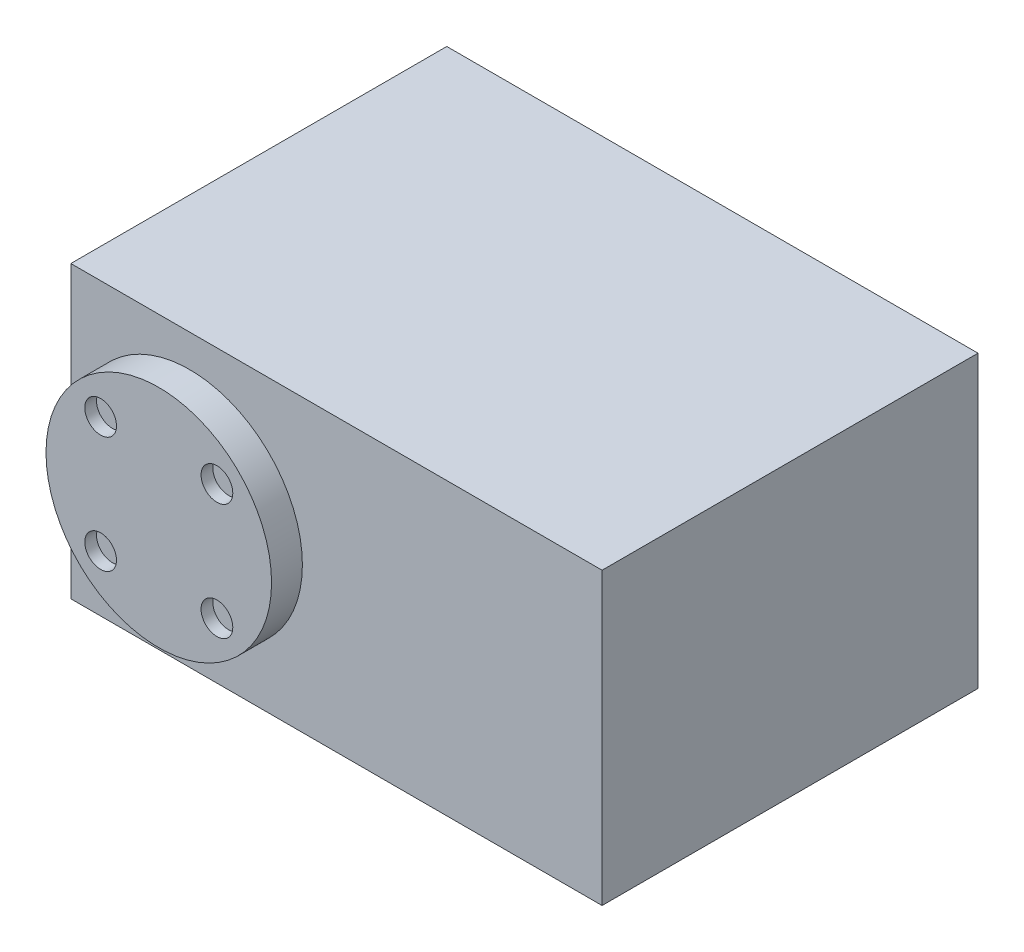
ISO-10303-21;
HEADER;
FILE_DESCRIPTION(('STEP AP214'),'2;1');
FILE_NAME('part.step','',(''),(''),'','','');
FILE_SCHEMA(('AUTOMOTIVE_DESIGN { 1 0 10303 214 1 1 1 1 }'));
ENDSEC;
DATA;
#1=APPLICATION_CONTEXT('core data for automotive mechanical design processes');
#2=APPLICATION_PROTOCOL_DEFINITION('international standard','automotive_design',2000,#1);
#3=PRODUCT_CONTEXT('',#1,'mechanical');
#4=PRODUCT('Part','Part','',(#3));
#5=PRODUCT_RELATED_PRODUCT_CATEGORY('part','',(#4));
#6=PRODUCT_DEFINITION_FORMATION('','',#4);
#7=PRODUCT_DEFINITION_CONTEXT('part definition',#1,'design');
#8=PRODUCT_DEFINITION('design','',#6,#7);
#9=PRODUCT_DEFINITION_SHAPE('','',#8);
#10=(LENGTH_UNIT() NAMED_UNIT(*) SI_UNIT(.MILLI.,.METRE.));
#11=(NAMED_UNIT(*) PLANE_ANGLE_UNIT() SI_UNIT($,.RADIAN.));
#12=(NAMED_UNIT(*) SI_UNIT($,.STERADIAN.) SOLID_ANGLE_UNIT());
#13=UNCERTAINTY_MEASURE_WITH_UNIT(LENGTH_MEASURE(1.E-05),#10,'distance_accuracy_value','');
#14=(GEOMETRIC_REPRESENTATION_CONTEXT(3) GLOBAL_UNCERTAINTY_ASSIGNED_CONTEXT((#13)) GLOBAL_UNIT_ASSIGNED_CONTEXT((#10,
#11,#12)) REPRESENTATION_CONTEXT('',''));
#15=CARTESIAN_POINT('',(0.,0.,0.));
#16=DIRECTION('',(0.,0.,1.));
#17=DIRECTION('',(1.,0.,0.));
#18=AXIS2_PLACEMENT_3D('',#15,#16,#17);
#19=CARTESIAN_POINT('',(-10.11,12.36,16.));
#20=DIRECTION('',(1.,0.,0.));
#21=DIRECTION('',(0.,0.,-1.));
#22=AXIS2_PLACEMENT_3D('',#19,#20,#21);
#23=PLANE('',#22);
#24=DIRECTION('',(0.,-1.,0.));
#25=VECTOR('',#24,1.);
#26=CARTESIAN_POINT('',(-10.11,12.36,-16.));
#27=LINE('',#26,#25);
#28=CARTESIAN_POINT('',(-10.11,12.36,-16.));
#29=VERTEX_POINT('',#28);
#30=CARTESIAN_POINT('',(-10.11,-12.36,-16.));
#31=VERTEX_POINT('',#30);
#32=EDGE_CURVE('E110',#29,#31,#27,.T.);
#33=ORIENTED_EDGE('',*,*,#32,.T.);
#34=DIRECTION('',(0.,0.,-1.));
#35=VECTOR('',#34,1.);
#36=CARTESIAN_POINT('',(-10.11,-12.36,16.));
#37=LINE('',#36,#35);
#38=CARTESIAN_POINT('',(-10.11,-12.36,16.));
#39=VERTEX_POINT('',#38);
#40=EDGE_CURVE('E48',#39,#31,#37,.T.);
#41=ORIENTED_EDGE('',*,*,#40,.F.);
#42=DIRECTION('',(0.,-1.,0.));
#43=VECTOR('',#42,1.);
#44=CARTESIAN_POINT('',(-10.11,12.36,16.));
#45=LINE('',#44,#43);
#46=CARTESIAN_POINT('',(-10.11,12.36,16.));
#47=VERTEX_POINT('',#46);
#48=EDGE_CURVE('E91',#47,#39,#45,.T.);
#49=ORIENTED_EDGE('',*,*,#48,.F.);
#50=DIRECTION('',(0.,0.,-1.));
#51=VECTOR('',#50,1.);
#52=CARTESIAN_POINT('',(-10.11,12.36,16.));
#53=LINE('',#52,#51);
#54=EDGE_CURVE('E103',#47,#29,#53,.T.);
#55=ORIENTED_EDGE('',*,*,#54,.T.);
#56=EDGE_LOOP('',(#33,#41,#49,#55));
#57=FACE_BOUND('',#56,.T.);
#58=ADVANCED_FACE('F39',(#57),#23,.F.);
#59=CARTESIAN_POINT('',(-10.11,-12.36,16.));
#60=DIRECTION('',(0.,1.,0.));
#61=DIRECTION('',(0.,0.,1.));
#62=AXIS2_PLACEMENT_3D('',#59,#60,#61);
#63=PLANE('',#62);
#64=DIRECTION('',(1.,0.,0.));
#65=VECTOR('',#64,1.);
#66=CARTESIAN_POINT('',(-10.11,-12.36,-16.));
#67=LINE('',#66,#65);
#68=CARTESIAN_POINT('',(35.11,-12.36,-16.));
#69=VERTEX_POINT('',#68);
#70=EDGE_CURVE('E98',#31,#69,#67,.T.);
#71=ORIENTED_EDGE('',*,*,#70,.T.);
#72=DIRECTION('',(0.,0.,-1.));
#73=VECTOR('',#72,1.);
#74=CARTESIAN_POINT('',(35.11,-12.36,16.));
#75=LINE('',#74,#73);
#76=CARTESIAN_POINT('',(35.11,-12.36,16.));
#77=VERTEX_POINT('',#76);
#78=EDGE_CURVE('E96',#77,#69,#75,.T.);
#79=ORIENTED_EDGE('',*,*,#78,.F.);
#80=DIRECTION('',(1.,0.,0.));
#81=VECTOR('',#80,1.);
#82=CARTESIAN_POINT('',(-10.11,-12.36,16.));
#83=LINE('',#82,#81);
#84=EDGE_CURVE('E86',#39,#77,#83,.T.);
#85=ORIENTED_EDGE('',*,*,#84,.F.);
#86=ORIENTED_EDGE('',*,*,#40,.T.);
#87=EDGE_LOOP('',(#71,#79,#85,#86));
#88=FACE_BOUND('',#87,.T.);
#89=ADVANCED_FACE('F100',(#88),#63,.F.);
#90=CARTESIAN_POINT('',(35.11,-12.36,16.));
#91=DIRECTION('',(-1.,0.,0.));
#92=DIRECTION('',(0.,0.,1.));
#93=AXIS2_PLACEMENT_3D('',#90,#91,#92);
#94=PLANE('',#93);
#95=DIRECTION('',(0.,1.,0.));
#96=VECTOR('',#95,1.);
#97=CARTESIAN_POINT('',(35.11,-12.36,-16.));
#98=LINE('',#97,#96);
#99=CARTESIAN_POINT('',(35.11,12.36,-16.));
#100=VERTEX_POINT('',#99);
#101=EDGE_CURVE('E74',#69,#100,#98,.T.);
#102=ORIENTED_EDGE('',*,*,#101,.T.);
#103=DIRECTION('',(0.,0.,-1.));
#104=VECTOR('',#103,1.);
#105=CARTESIAN_POINT('',(35.11,12.36,16.));
#106=LINE('',#105,#104);
#107=CARTESIAN_POINT('',(35.11,12.36,16.));
#108=VERTEX_POINT('',#107);
#109=EDGE_CURVE('E97',#108,#100,#106,.T.);
#110=ORIENTED_EDGE('',*,*,#109,.F.);
#111=DIRECTION('',(0.,1.,0.));
#112=VECTOR('',#111,1.);
#113=CARTESIAN_POINT('',(35.11,-12.36,16.));
#114=LINE('',#113,#112);
#115=EDGE_CURVE('E93',#77,#108,#114,.T.);
#116=ORIENTED_EDGE('',*,*,#115,.F.);
#117=ORIENTED_EDGE('',*,*,#78,.T.);
#118=EDGE_LOOP('',(#102,#110,#116,#117));
#119=FACE_BOUND('',#118,.T.);
#120=ADVANCED_FACE('F101',(#119),#94,.F.);
#121=CARTESIAN_POINT('',(35.11,12.36,16.));
#122=DIRECTION('',(0.,-1.,0.));
#123=DIRECTION('',(0.,0.,-1.));
#124=AXIS2_PLACEMENT_3D('',#121,#122,#123);
#125=PLANE('',#124);
#126=DIRECTION('',(-1.,0.,0.));
#127=VECTOR('',#126,1.);
#128=CARTESIAN_POINT('',(35.11,12.36,-16.));
#129=LINE('',#128,#127);
#130=EDGE_CURVE('E77',#100,#29,#129,.T.);
#131=ORIENTED_EDGE('',*,*,#130,.T.);
#132=ORIENTED_EDGE('',*,*,#54,.F.);
#133=DIRECTION('',(-1.,0.,0.));
#134=VECTOR('',#133,1.);
#135=CARTESIAN_POINT('',(35.11,12.36,16.));
#136=LINE('',#135,#134);
#137=EDGE_CURVE('E60',#108,#47,#136,.T.);
#138=ORIENTED_EDGE('',*,*,#137,.F.);
#139=ORIENTED_EDGE('',*,*,#109,.T.);
#140=EDGE_LOOP('',(#131,#132,#138,#139));
#141=FACE_BOUND('',#140,.T.);
#142=ADVANCED_FACE('F176',(#141),#125,.F.);
#143=CARTESIAN_POINT('',(0.,0.,16.));
#144=DIRECTION('',(0.,0.,1.));
#145=DIRECTION('',(1.,0.,0.));
#146=AXIS2_PLACEMENT_3D('',#143,#144,#145);
#147=PLANE('',#146);
#148=CARTESIAN_POINT('',(0.,0.,16.));
#149=DIRECTION('',(0.,0.,1.));
#150=DIRECTION('',(1.,0.,0.));
#151=AXIS2_PLACEMENT_3D('',#148,#149,#150);
#152=CIRCLE('',#151,9.6);
#153=CARTESIAN_POINT('',(9.6,0.,16.));
#154=VERTEX_POINT('',#153);
#155=EDGE_CURVE('E109',#154,#154,#152,.F.);
#156=ORIENTED_EDGE('',*,*,#155,.T.);
#157=EDGE_LOOP('',(#156));
#158=FACE_BOUND('',#157,.T.);
#159=ORIENTED_EDGE('',*,*,#48,.T.);
#160=ORIENTED_EDGE('',*,*,#84,.T.);
#161=ORIENTED_EDGE('',*,*,#115,.T.);
#162=ORIENTED_EDGE('',*,*,#137,.T.);
#163=EDGE_LOOP('',(#159,#160,#161,#162));
#164=FACE_BOUND('',#163,.T.);
#165=ADVANCED_FACE('F90',(#158,#164),#147,.T.);
#166=CARTESIAN_POINT('',(0.,0.,-16.));
#167=DIRECTION('',(0.,0.,1.));
#168=DIRECTION('',(1.,0.,0.));
#169=AXIS2_PLACEMENT_3D('',#166,#167,#168);
#170=PLANE('',#169);
#171=CARTESIAN_POINT('',(0.,0.,-16.));
#172=DIRECTION('',(0.,0.,1.));
#173=DIRECTION('',(1.,0.,0.));
#174=AXIS2_PLACEMENT_3D('',#171,#172,#173);
#175=CIRCLE('',#174,9.6);
#176=CARTESIAN_POINT('',(9.6,0.,-16.));
#177=VERTEX_POINT('',#176);
#178=EDGE_CURVE('E11',#177,#177,#175,.F.);
#179=ORIENTED_EDGE('',*,*,#178,.F.);
#180=EDGE_LOOP('',(#179));
#181=FACE_BOUND('',#180,.T.);
#182=ORIENTED_EDGE('',*,*,#32,.F.);
#183=ORIENTED_EDGE('',*,*,#130,.F.);
#184=ORIENTED_EDGE('',*,*,#101,.F.);
#185=ORIENTED_EDGE('',*,*,#70,.F.);
#186=EDGE_LOOP('',(#182,#183,#184,#185));
#187=FACE_BOUND('',#186,.T.);
#188=ADVANCED_FACE('F152',(#181,#187),#170,.F.);
#189=CARTESIAN_POINT('',(0.,0.,18.625));
#190=DIRECTION('',(0.,0.,-1.));
#191=DIRECTION('',(-1.,0.,0.));
#192=AXIS2_PLACEMENT_3D('',#189,#190,#191);
#193=CYLINDRICAL_SURFACE('',#192,9.6);
#194=ORIENTED_EDGE('',*,*,#155,.F.);
#195=EDGE_LOOP('',(#194));
#196=FACE_BOUND('',#195,.T.);
#197=CARTESIAN_POINT('',(0.,0.,18.625));
#198=DIRECTION('',(0.,0.,1.));
#199=DIRECTION('',(1.,0.,0.));
#200=AXIS2_PLACEMENT_3D('',#197,#198,#199);
#201=CIRCLE('',#200,9.6);
#202=CARTESIAN_POINT('',(9.6,0.,18.625));
#203=VERTEX_POINT('',#202);
#204=EDGE_CURVE('E116',#203,#203,#201,.T.);
#205=ORIENTED_EDGE('',*,*,#204,.F.);
#206=EDGE_LOOP('',(#205));
#207=FACE_BOUND('',#206,.T.);
#208=ADVANCED_FACE('F155',(#196,#207),#193,.T.);
#209=CARTESIAN_POINT('',(0.,0.,18.625));
#210=DIRECTION('',(0.,0.,1.));
#211=DIRECTION('',(1.,0.,0.));
#212=AXIS2_PLACEMENT_3D('',#209,#210,#211);
#213=PLANE('',#212);
#214=CARTESIAN_POINT('',(4.94974746830583,-4.94974746830583,18.625));
#215=DIRECTION('',(0.,0.,1.));
#216=DIRECTION('',(1.,0.,0.));
#217=AXIS2_PLACEMENT_3D('',#214,#215,#216);
#218=CIRCLE('',#217,1.35);
#219=CARTESIAN_POINT('',(6.29974746830583,-4.94974746830583,18.625));
#220=VERTEX_POINT('',#219);
#221=EDGE_CURVE('E45',#220,#220,#218,.F.);
#222=ORIENTED_EDGE('',*,*,#221,.T.);
#223=EDGE_LOOP('',(#222));
#224=FACE_BOUND('',#223,.T.);
#225=CARTESIAN_POINT('',(-4.94974746830583,-4.94974746830583,18.625));
#226=DIRECTION('',(0.,0.,1.));
#227=DIRECTION('',(1.,0.,0.));
#228=AXIS2_PLACEMENT_3D('',#225,#226,#227);
#229=CIRCLE('',#228,1.35);
#230=CARTESIAN_POINT('',(-3.59974746830583,-4.94974746830583,18.625));
#231=VERTEX_POINT('',#230);
#232=EDGE_CURVE('E126',#231,#231,#229,.F.);
#233=ORIENTED_EDGE('',*,*,#232,.T.);
#234=EDGE_LOOP('',(#233));
#235=FACE_BOUND('',#234,.T.);
#236=CARTESIAN_POINT('',(-4.94974746830583,4.94974746830583,18.625));
#237=DIRECTION('',(0.,0.,1.));
#238=DIRECTION('',(1.,0.,0.));
#239=AXIS2_PLACEMENT_3D('',#236,#237,#238);
#240=CIRCLE('',#239,1.35);
#241=CARTESIAN_POINT('',(-3.59974746830583,4.94974746830583,18.625));
#242=VERTEX_POINT('',#241);
#243=EDGE_CURVE('E124',#242,#242,#240,.F.);
#244=ORIENTED_EDGE('',*,*,#243,.T.);
#245=EDGE_LOOP('',(#244));
#246=FACE_BOUND('',#245,.T.);
#247=CARTESIAN_POINT('',(4.94974746830583,4.94974746830583,18.625));
#248=DIRECTION('',(0.,0.,1.));
#249=DIRECTION('',(1.,0.,0.));
#250=AXIS2_PLACEMENT_3D('',#247,#248,#249);
#251=CIRCLE('',#250,1.35);
#252=CARTESIAN_POINT('',(6.29974746830583,4.94974746830583,18.625));
#253=VERTEX_POINT('',#252);
#254=EDGE_CURVE('E117',#253,#253,#251,.F.);
#255=ORIENTED_EDGE('',*,*,#254,.T.);
#256=EDGE_LOOP('',(#255));
#257=FACE_BOUND('',#256,.T.);
#258=ORIENTED_EDGE('',*,*,#204,.T.);
#259=EDGE_LOOP('',(#258));
#260=FACE_BOUND('',#259,.T.);
#261=ADVANCED_FACE('F147',(#224,#235,#246,#257,#260),#213,.T.);
#262=CARTESIAN_POINT('',(0.,0.,-15.5));
#263=DIRECTION('',(0.,0.,-1.));
#264=DIRECTION('',(-1.,0.,0.));
#265=AXIS2_PLACEMENT_3D('',#262,#263,#264);
#266=CYLINDRICAL_SURFACE('',#265,9.6);
#267=CARTESIAN_POINT('',(0.,0.,-18.625));
#268=DIRECTION('',(0.,0.,1.));
#269=DIRECTION('',(1.,0.,0.));
#270=AXIS2_PLACEMENT_3D('',#267,#268,#269);
#271=CIRCLE('',#270,9.6);
#272=CARTESIAN_POINT('',(9.6,0.,-18.625));
#273=VERTEX_POINT('',#272);
#274=EDGE_CURVE('E122',#273,#273,#271,.T.);
#275=ORIENTED_EDGE('',*,*,#274,.T.);
#276=EDGE_LOOP('',(#275));
#277=FACE_BOUND('',#276,.T.);
#278=ORIENTED_EDGE('',*,*,#178,.T.);
#279=EDGE_LOOP('',(#278));
#280=FACE_BOUND('',#279,.T.);
#281=ADVANCED_FACE('F165',(#277,#280),#266,.T.);
#282=CARTESIAN_POINT('',(0.,0.,-18.625));
#283=DIRECTION('',(0.,0.,1.));
#284=DIRECTION('',(1.,0.,0.));
#285=AXIS2_PLACEMENT_3D('',#282,#283,#284);
#286=PLANE('',#285);
#287=ORIENTED_EDGE('',*,*,#274,.F.);
#288=EDGE_LOOP('',(#287));
#289=FACE_BOUND('',#288,.T.);
#290=ADVANCED_FACE('F226',(#289),#286,.F.);
#291=CARTESIAN_POINT('',(4.94974746830583,4.94974746830583,18.725));
#292=DIRECTION('',(0.,0.,-1.));
#293=DIRECTION('',(-1.,0.,0.));
#294=AXIS2_PLACEMENT_3D('',#291,#292,#293);
#295=CYLINDRICAL_SURFACE('',#294,1.35);
#296=ORIENTED_EDGE('',*,*,#254,.F.);
#297=EDGE_LOOP('',(#296));
#298=FACE_BOUND('',#297,.T.);
#299=CARTESIAN_POINT('',(4.94974746830583,4.94974746830583,17.625));
#300=DIRECTION('',(0.,0.,1.));
#301=DIRECTION('',(1.,0.,0.));
#302=AXIS2_PLACEMENT_3D('',#299,#300,#301);
#303=CIRCLE('',#302,1.35);
#304=CARTESIAN_POINT('',(6.29974746830583,4.94974746830583,17.625));
#305=VERTEX_POINT('',#304);
#306=EDGE_CURVE('E123',#305,#305,#303,.T.);
#307=ORIENTED_EDGE('',*,*,#306,.F.);
#308=EDGE_LOOP('',(#307));
#309=FACE_BOUND('',#308,.T.);
#310=ADVANCED_FACE('F240',(#298,#309),#295,.F.);
#311=CARTESIAN_POINT('',(4.94974746830583,4.94974746830583,17.625));
#312=DIRECTION('',(0.,0.,1.));
#313=DIRECTION('',(1.,0.,0.));
#314=AXIS2_PLACEMENT_3D('',#311,#312,#313);
#315=PLANE('',#314);
#316=ORIENTED_EDGE('',*,*,#306,.T.);
#317=EDGE_LOOP('',(#316));
#318=FACE_BOUND('',#317,.T.);
#319=ADVANCED_FACE('F246',(#318),#315,.T.);
#320=CARTESIAN_POINT('',(-4.94974746830583,4.94974746830583,18.725));
#321=DIRECTION('',(0.,0.,-1.));
#322=DIRECTION('',(-1.,0.,0.));
#323=AXIS2_PLACEMENT_3D('',#320,#321,#322);
#324=CYLINDRICAL_SURFACE('',#323,1.35);
#325=ORIENTED_EDGE('',*,*,#243,.F.);
#326=EDGE_LOOP('',(#325));
#327=FACE_BOUND('',#326,.T.);
#328=CARTESIAN_POINT('',(-4.94974746830583,4.94974746830583,17.625));
#329=DIRECTION('',(0.,0.,1.));
#330=DIRECTION('',(1.,0.,0.));
#331=AXIS2_PLACEMENT_3D('',#328,#329,#330);
#332=CIRCLE('',#331,1.35);
#333=CARTESIAN_POINT('',(-3.59974746830583,4.94974746830583,17.625));
#334=VERTEX_POINT('',#333);
#335=EDGE_CURVE('E130',#334,#334,#332,.T.);
#336=ORIENTED_EDGE('',*,*,#335,.F.);
#337=EDGE_LOOP('',(#336));
#338=FACE_BOUND('',#337,.T.);
#339=ADVANCED_FACE('F254',(#327,#338),#324,.F.);
#340=CARTESIAN_POINT('',(-4.94974746830583,4.94974746830583,17.625));
#341=DIRECTION('',(0.,0.,1.));
#342=DIRECTION('',(1.,0.,0.));
#343=AXIS2_PLACEMENT_3D('',#340,#341,#342);
#344=PLANE('',#343);
#345=ORIENTED_EDGE('',*,*,#335,.T.);
#346=EDGE_LOOP('',(#345));
#347=FACE_BOUND('',#346,.T.);
#348=ADVANCED_FACE('F262',(#347),#344,.T.);
#349=CARTESIAN_POINT('',(-4.94974746830583,-4.94974746830583,18.725));
#350=DIRECTION('',(0.,0.,-1.));
#351=DIRECTION('',(-1.,0.,0.));
#352=AXIS2_PLACEMENT_3D('',#349,#350,#351);
#353=CYLINDRICAL_SURFACE('',#352,1.35);
#354=ORIENTED_EDGE('',*,*,#232,.F.);
#355=EDGE_LOOP('',(#354));
#356=FACE_BOUND('',#355,.T.);
#357=CARTESIAN_POINT('',(-4.94974746830583,-4.94974746830583,17.625));
#358=DIRECTION('',(0.,0.,1.));
#359=DIRECTION('',(1.,0.,0.));
#360=AXIS2_PLACEMENT_3D('',#357,#358,#359);
#361=CIRCLE('',#360,1.35);
#362=CARTESIAN_POINT('',(-3.59974746830583,-4.94974746830583,17.625));
#363=VERTEX_POINT('',#362);
#364=EDGE_CURVE('E128',#363,#363,#361,.T.);
#365=ORIENTED_EDGE('',*,*,#364,.F.);
#366=EDGE_LOOP('',(#365));
#367=FACE_BOUND('',#366,.T.);
#368=ADVANCED_FACE('F272',(#356,#367),#353,.F.);
#369=CARTESIAN_POINT('',(-4.94974746830583,-4.94974746830583,17.625));
#370=DIRECTION('',(0.,0.,1.));
#371=DIRECTION('',(1.,0.,0.));
#372=AXIS2_PLACEMENT_3D('',#369,#370,#371);
#373=PLANE('',#372);
#374=ORIENTED_EDGE('',*,*,#364,.T.);
#375=EDGE_LOOP('',(#374));
#376=FACE_BOUND('',#375,.T.);
#377=ADVANCED_FACE('F285',(#376),#373,.T.);
#378=CARTESIAN_POINT('',(4.94974746830583,-4.94974746830583,18.725));
#379=DIRECTION('',(0.,0.,-1.));
#380=DIRECTION('',(-1.,0.,0.));
#381=AXIS2_PLACEMENT_3D('',#378,#379,#380);
#382=CYLINDRICAL_SURFACE('',#381,1.35);
#383=ORIENTED_EDGE('',*,*,#221,.F.);
#384=EDGE_LOOP('',(#383));
#385=FACE_BOUND('',#384,.T.);
#386=CARTESIAN_POINT('',(4.94974746830583,-4.94974746830583,17.625));
#387=DIRECTION('',(0.,0.,1.));
#388=DIRECTION('',(1.,0.,0.));
#389=AXIS2_PLACEMENT_3D('',#386,#387,#388);
#390=CIRCLE('',#389,1.35);
#391=CARTESIAN_POINT('',(6.29974746830583,-4.94974746830583,17.625));
#392=VERTEX_POINT('',#391);
#393=EDGE_CURVE('E139',#392,#392,#390,.T.);
#394=ORIENTED_EDGE('',*,*,#393,.F.);
#395=EDGE_LOOP('',(#394));
#396=FACE_BOUND('',#395,.T.);
#397=ADVANCED_FACE('F292',(#385,#396),#382,.F.);
#398=CARTESIAN_POINT('',(4.94974746830583,-4.94974746830583,17.625));
#399=DIRECTION('',(0.,0.,1.));
#400=DIRECTION('',(1.,0.,0.));
#401=AXIS2_PLACEMENT_3D('',#398,#399,#400);
#402=PLANE('',#401);
#403=ORIENTED_EDGE('',*,*,#393,.T.);
#404=EDGE_LOOP('',(#403));
#405=FACE_BOUND('',#404,.T.);
#406=ADVANCED_FACE('F299',(#405),#402,.T.);
#407=CLOSED_SHELL('',(#58,#89,#120,#142,#165,#188,#208,#261,#281,#290,#310,#319,#339,#348,#368,
#377,#397,#406));
#408=MANIFOLD_SOLID_BREP('B2',#407);
#409=ADVANCED_BREP_SHAPE_REPRESENTATION('',(#18,#408),#14);
#410=SHAPE_DEFINITION_REPRESENTATION(#9,#409);
ENDSEC;
END-ISO-10303-21;
